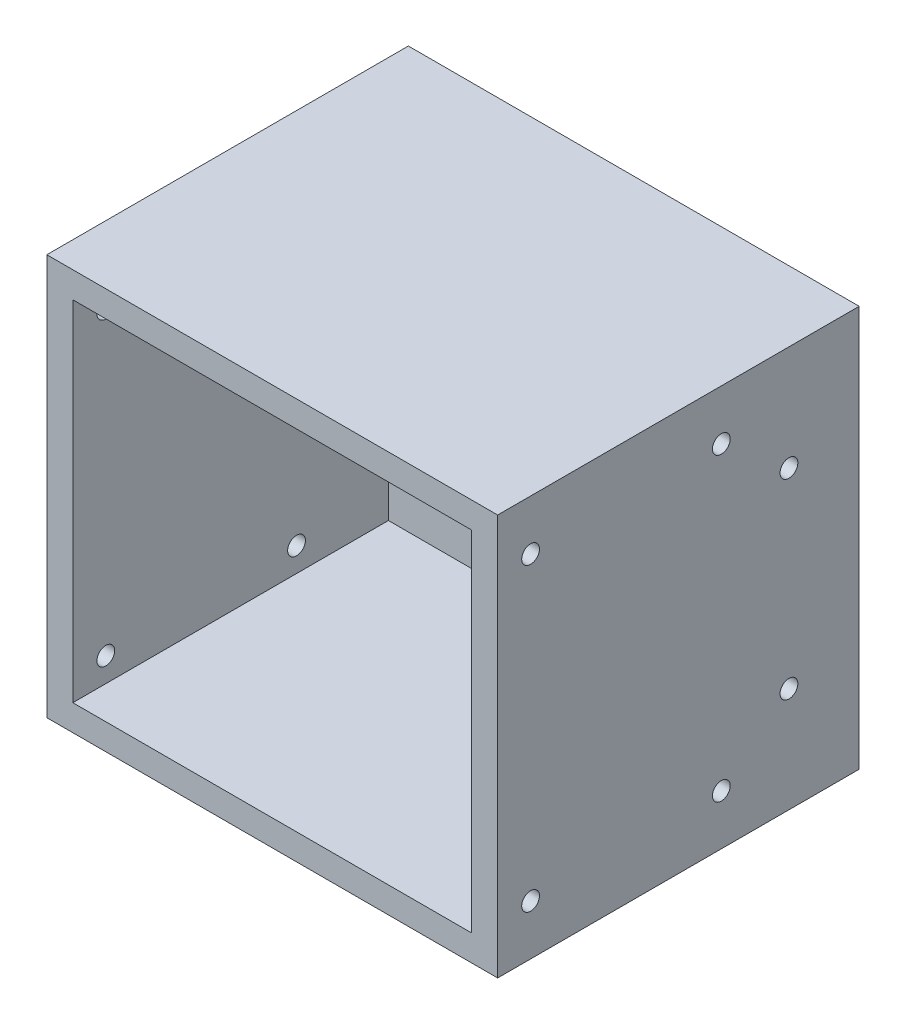
ISO-10303-21;
HEADER;
FILE_DESCRIPTION(('STEP AP214'),'2;1');
FILE_NAME('part.step','',(''),(''),'','','');
FILE_SCHEMA(('AUTOMOTIVE_DESIGN { 1 0 10303 214 1 1 1 1 }'));
ENDSEC;
DATA;
#1=APPLICATION_CONTEXT('core data for automotive mechanical design processes');
#2=APPLICATION_PROTOCOL_DEFINITION('international standard','automotive_design',2000,#1);
#3=PRODUCT_CONTEXT('',#1,'mechanical');
#4=PRODUCT('Part','Part','',(#3));
#5=PRODUCT_RELATED_PRODUCT_CATEGORY('part','',(#4));
#6=PRODUCT_DEFINITION_FORMATION('','',#4);
#7=PRODUCT_DEFINITION_CONTEXT('part definition',#1,'design');
#8=PRODUCT_DEFINITION('design','',#6,#7);
#9=PRODUCT_DEFINITION_SHAPE('','',#8);
#10=(LENGTH_UNIT() NAMED_UNIT(*) SI_UNIT(.MILLI.,.METRE.));
#11=(NAMED_UNIT(*) PLANE_ANGLE_UNIT() SI_UNIT($,.RADIAN.));
#12=(NAMED_UNIT(*) SI_UNIT($,.STERADIAN.) SOLID_ANGLE_UNIT());
#13=UNCERTAINTY_MEASURE_WITH_UNIT(LENGTH_MEASURE(1.E-05),#10,'distance_accuracy_value','');
#14=(GEOMETRIC_REPRESENTATION_CONTEXT(3) GLOBAL_UNCERTAINTY_ASSIGNED_CONTEXT((#13)) GLOBAL_UNIT_ASSIGNED_CONTEXT((#10,
#11,#12)) REPRESENTATION_CONTEXT('',''));
#15=CARTESIAN_POINT('',(0.,0.,0.));
#16=DIRECTION('',(0.,0.,1.));
#17=DIRECTION('',(1.,0.,0.));
#18=AXIS2_PLACEMENT_3D('',#15,#16,#17);
#19=CARTESIAN_POINT('',(0.,0.,-5.3));
#20=DIRECTION('',(0.,0.,-1.));
#21=DIRECTION('',(-1.,0.,0.));
#22=AXIS2_PLACEMENT_3D('',#19,#20,#21);
#23=PLANE('',#22);
#24=CARTESIAN_POINT('',(0.,0.,-5.3));
#25=DIRECTION('',(0.,0.,1.));
#26=DIRECTION('',(1.,0.,0.));
#27=AXIS2_PLACEMENT_3D('',#24,#25,#26);
#28=CIRCLE('',#27,14.);
#29=CARTESIAN_POINT('',(14.,0.,-5.3));
#30=VERTEX_POINT('',#29);
#31=EDGE_CURVE('E238',#30,#30,#28,.T.);
#32=ORIENTED_EDGE('',*,*,#31,.T.);
#33=EDGE_LOOP('',(#32));
#34=FACE_BOUND('',#33,.T.);
#35=DIRECTION('',(-1.,0.,0.));
#36=VECTOR('',#35,1.);
#37=CARTESIAN_POINT('',(-26.,23.125,-5.3));
#38=LINE('',#37,#36);
#39=CARTESIAN_POINT('',(26.,23.125,-5.30000000000001));
#40=VERTEX_POINT('',#39);
#41=CARTESIAN_POINT('',(-26.,23.125,-5.3));
#42=VERTEX_POINT('',#41);
#43=EDGE_CURVE('E166',#40,#42,#38,.T.);
#44=ORIENTED_EDGE('',*,*,#43,.F.);
#45=DIRECTION('',(0.,1.,0.));
#46=VECTOR('',#45,1.);
#47=CARTESIAN_POINT('',(26.,23.125,-5.30000000000001));
#48=LINE('',#47,#46);
#49=CARTESIAN_POINT('',(26.,-23.125,-5.29999999999999));
#50=VERTEX_POINT('',#49);
#51=EDGE_CURVE('E125',#50,#40,#48,.T.);
#52=ORIENTED_EDGE('',*,*,#51,.F.);
#53=DIRECTION('',(1.,0.,0.));
#54=VECTOR('',#53,1.);
#55=CARTESIAN_POINT('',(-26.,-23.125,-5.3));
#56=LINE('',#55,#54);
#57=CARTESIAN_POINT('',(-26.,-23.125,-5.3));
#58=VERTEX_POINT('',#57);
#59=EDGE_CURVE('E123',#58,#50,#56,.T.);
#60=ORIENTED_EDGE('',*,*,#59,.F.);
#61=DIRECTION('',(0.,-1.,0.));
#62=VECTOR('',#61,1.);
#63=CARTESIAN_POINT('',(-26.,-20.125,-5.3));
#64=LINE('',#63,#62);
#65=EDGE_CURVE('E108',#42,#58,#64,.T.);
#66=ORIENTED_EDGE('',*,*,#65,.F.);
#67=EDGE_LOOP('',(#44,#52,#60,#66));
#68=FACE_BOUND('',#67,.T.);
#69=ADVANCED_FACE('F39',(#34,#68),#23,.T.);
#70=CARTESIAN_POINT('',(0.,0.,0.));
#71=DIRECTION('',(0.,0.,-1.));
#72=DIRECTION('',(-1.,0.,0.));
#73=AXIS2_PLACEMENT_3D('',#70,#71,#72);
#74=PLANE('',#73);
#75=CARTESIAN_POINT('',(0.,0.,0.));
#76=DIRECTION('',(0.,0.,1.));
#77=DIRECTION('',(1.,0.,0.));
#78=AXIS2_PLACEMENT_3D('',#75,#76,#77);
#79=CIRCLE('',#78,14.);
#80=CARTESIAN_POINT('',(14.,0.,0.));
#81=VERTEX_POINT('',#80);
#82=EDGE_CURVE('E119',#81,#81,#79,.T.);
#83=ORIENTED_EDGE('',*,*,#82,.F.);
#84=EDGE_LOOP('',(#83));
#85=FACE_BOUND('',#84,.T.);
#86=DIRECTION('',(0.,1.,0.));
#87=VECTOR('',#86,1.);
#88=CARTESIAN_POINT('',(23.,-20.125,0.));
#89=LINE('',#88,#87);
#90=CARTESIAN_POINT('',(23.,-20.125,0.));
#91=VERTEX_POINT('',#90);
#92=CARTESIAN_POINT('',(23.,20.125,0.));
#93=VERTEX_POINT('',#92);
#94=EDGE_CURVE('E242',#91,#93,#89,.T.);
#95=ORIENTED_EDGE('',*,*,#94,.T.);
#96=DIRECTION('',(-1.,0.,0.));
#97=VECTOR('',#96,1.);
#98=CARTESIAN_POINT('',(-23.,20.125,0.));
#99=LINE('',#98,#97);
#100=CARTESIAN_POINT('',(-23.,20.125,0.));
#101=VERTEX_POINT('',#100);
#102=EDGE_CURVE('E249',#93,#101,#99,.T.);
#103=ORIENTED_EDGE('',*,*,#102,.T.);
#104=DIRECTION('',(0.,-1.,0.));
#105=VECTOR('',#104,1.);
#106=CARTESIAN_POINT('',(-23.,-20.125,0.));
#107=LINE('',#106,#105);
#108=CARTESIAN_POINT('',(-23.,-20.125,0.));
#109=VERTEX_POINT('',#108);
#110=EDGE_CURVE('E49',#101,#109,#107,.T.);
#111=ORIENTED_EDGE('',*,*,#110,.T.);
#112=DIRECTION('',(1.,0.,0.));
#113=VECTOR('',#112,1.);
#114=CARTESIAN_POINT('',(-23.,-20.125,0.));
#115=LINE('',#114,#113);
#116=EDGE_CURVE('E11',#109,#91,#115,.T.);
#117=ORIENTED_EDGE('',*,*,#116,.T.);
#118=EDGE_LOOP('',(#95,#103,#111,#117));
#119=FACE_BOUND('',#118,.T.);
#120=ADVANCED_FACE('F41',(#85,#119),#74,.F.);
#121=CARTESIAN_POINT('',(0.,0.,-5.3));
#122=DIRECTION('',(0.,0.,1.));
#123=DIRECTION('',(1.,0.,0.));
#124=AXIS2_PLACEMENT_3D('',#121,#122,#123);
#125=CYLINDRICAL_SURFACE('',#124,14.);
#126=ORIENTED_EDGE('',*,*,#31,.F.);
#127=EDGE_LOOP('',(#126));
#128=FACE_BOUND('',#127,.T.);
#129=ORIENTED_EDGE('',*,*,#82,.T.);
#130=EDGE_LOOP('',(#129));
#131=FACE_BOUND('',#130,.T.);
#132=ADVANCED_FACE('F298',(#128,#131),#125,.F.);
#133=CARTESIAN_POINT('',(-26.,0.,0.));
#134=DIRECTION('',(-1.,0.,0.));
#135=DIRECTION('',(0.,0.,1.));
#136=AXIS2_PLACEMENT_3D('',#133,#134,#135);
#137=PLANE('',#136);
#138=CARTESIAN_POINT('',(-26.,11.0249999999998,2.80000000000001));
#139=DIRECTION('',(-1.,0.,0.));
#140=DIRECTION('',(0.,0.,1.));
#141=AXIS2_PLACEMENT_3D('',#138,#139,#140);
#142=CIRCLE('',#141,1.025);
#143=CARTESIAN_POINT('',(-26.,11.0249999999998,3.82500000000001));
#144=VERTEX_POINT('',#143);
#145=EDGE_CURVE('E189',#144,#144,#142,.T.);
#146=ORIENTED_EDGE('',*,*,#145,.F.);
#147=EDGE_LOOP('',(#146));
#148=FACE_BOUND('',#147,.T.);
#149=CARTESIAN_POINT('',(-26.,-17.3249999999999,10.6));
#150=DIRECTION('',(-1.,0.,0.));
#151=DIRECTION('',(0.,0.,-1.));
#152=AXIS2_PLACEMENT_3D('',#149,#150,#151);
#153=CIRCLE('',#152,1.025);
#154=CARTESIAN_POINT('',(-26.,-17.3249999999999,9.575));
#155=VERTEX_POINT('',#154);
#156=EDGE_CURVE('E205',#155,#155,#153,.T.);
#157=ORIENTED_EDGE('',*,*,#156,.F.);
#158=EDGE_LOOP('',(#157));
#159=FACE_BOUND('',#158,.T.);
#160=CARTESIAN_POINT('',(-26.,17.325,32.6));
#161=DIRECTION('',(-1.,0.,0.));
#162=DIRECTION('',(0.,0.,1.));
#163=AXIS2_PLACEMENT_3D('',#160,#161,#162);
#164=CIRCLE('',#163,1.025);
#165=CARTESIAN_POINT('',(-26.,17.325,33.625));
#166=VERTEX_POINT('',#165);
#167=EDGE_CURVE('E221',#166,#166,#164,.T.);
#168=ORIENTED_EDGE('',*,*,#167,.F.);
#169=EDGE_LOOP('',(#168));
#170=FACE_BOUND('',#169,.T.);
#171=ORIENTED_EDGE('',*,*,#65,.T.);
#172=DIRECTION('',(0.,0.,-1.));
#173=VECTOR('',#172,1.);
#174=CARTESIAN_POINT('',(-26.,-23.125,36.4));
#175=LINE('',#174,#173);
#176=CARTESIAN_POINT('',(-26.,-23.125,36.4));
#177=VERTEX_POINT('',#176);
#178=EDGE_CURVE('E113',#177,#58,#175,.T.);
#179=ORIENTED_EDGE('',*,*,#178,.F.);
#180=DIRECTION('',(0.,1.,0.));
#181=VECTOR('',#180,1.);
#182=CARTESIAN_POINT('',(-26.,-20.125,36.4));
#183=LINE('',#182,#181);
#184=CARTESIAN_POINT('',(-26.,23.125,36.4));
#185=VERTEX_POINT('',#184);
#186=EDGE_CURVE('E120',#177,#185,#183,.T.);
#187=ORIENTED_EDGE('',*,*,#186,.T.);
#188=DIRECTION('',(0.,0.,1.));
#189=VECTOR('',#188,1.);
#190=CARTESIAN_POINT('',(-26.,23.125,-5.3));
#191=LINE('',#190,#189);
#192=EDGE_CURVE('E115',#42,#185,#191,.T.);
#193=ORIENTED_EDGE('',*,*,#192,.F.);
#194=EDGE_LOOP('',(#171,#179,#187,#193));
#195=FACE_BOUND('',#194,.T.);
#196=CARTESIAN_POINT('',(-26.,17.3249999999999,10.6));
#197=DIRECTION('',(-1.,0.,0.));
#198=DIRECTION('',(0.,0.,1.));
#199=AXIS2_PLACEMENT_3D('',#196,#197,#198);
#200=CIRCLE('',#199,1.025);
#201=CARTESIAN_POINT('',(-26.,17.3249999999999,11.625));
#202=VERTEX_POINT('',#201);
#203=EDGE_CURVE('E213',#202,#202,#200,.T.);
#204=ORIENTED_EDGE('',*,*,#203,.F.);
#205=EDGE_LOOP('',(#204));
#206=FACE_BOUND('',#205,.T.);
#207=CARTESIAN_POINT('',(-26.,-17.325,32.6));
#208=DIRECTION('',(-1.,0.,0.));
#209=DIRECTION('',(0.,0.,-1.));
#210=AXIS2_PLACEMENT_3D('',#207,#208,#209);
#211=CIRCLE('',#210,1.025);
#212=CARTESIAN_POINT('',(-26.,-17.325,31.575));
#213=VERTEX_POINT('',#212);
#214=EDGE_CURVE('E197',#213,#213,#211,.T.);
#215=ORIENTED_EDGE('',*,*,#214,.F.);
#216=EDGE_LOOP('',(#215));
#217=FACE_BOUND('',#216,.T.);
#218=CARTESIAN_POINT('',(-26.,-11.0249999999998,2.80000000000001));
#219=DIRECTION('',(-1.,0.,0.));
#220=DIRECTION('',(0.,0.,-1.));
#221=AXIS2_PLACEMENT_3D('',#218,#219,#220);
#222=CIRCLE('',#221,1.025);
#223=CARTESIAN_POINT('',(-26.,-11.0249999999998,1.77500000000001));
#224=VERTEX_POINT('',#223);
#225=EDGE_CURVE('E181',#224,#224,#222,.T.);
#226=ORIENTED_EDGE('',*,*,#225,.F.);
#227=EDGE_LOOP('',(#226));
#228=FACE_BOUND('',#227,.T.);
#229=ADVANCED_FACE('F110',(#148,#159,#170,#195,#206,#217,#228),#137,.T.);
#230=CARTESIAN_POINT('',(-23.,0.,0.));
#231=DIRECTION('',(-1.,0.,0.));
#232=DIRECTION('',(0.,0.,1.));
#233=AXIS2_PLACEMENT_3D('',#230,#231,#232);
#234=PLANE('',#233);
#235=ORIENTED_EDGE('',*,*,#110,.F.);
#236=DIRECTION('',(0.,0.,-1.));
#237=VECTOR('',#236,1.);
#238=CARTESIAN_POINT('',(-23.,20.125,-5.3));
#239=LINE('',#238,#237);
#240=CARTESIAN_POINT('',(-23.,20.125,36.4));
#241=VERTEX_POINT('',#240);
#242=EDGE_CURVE('E229',#241,#101,#239,.T.);
#243=ORIENTED_EDGE('',*,*,#242,.F.);
#244=DIRECTION('',(0.,1.,0.));
#245=VECTOR('',#244,1.);
#246=CARTESIAN_POINT('',(-23.,-20.125,36.4));
#247=LINE('',#246,#245);
#248=CARTESIAN_POINT('',(-23.,-20.125,36.4));
#249=VERTEX_POINT('',#248);
#250=EDGE_CURVE('E64',#249,#241,#247,.T.);
#251=ORIENTED_EDGE('',*,*,#250,.F.);
#252=DIRECTION('',(0.,0.,1.));
#253=VECTOR('',#252,1.);
#254=CARTESIAN_POINT('',(-23.,-20.125,-5.3));
#255=LINE('',#254,#253);
#256=EDGE_CURVE('E57',#109,#249,#255,.T.);
#257=ORIENTED_EDGE('',*,*,#256,.F.);
#258=EDGE_LOOP('',(#235,#243,#251,#257));
#259=FACE_BOUND('',#258,.T.);
#260=CARTESIAN_POINT('',(-23.,17.325,32.6));
#261=DIRECTION('',(-1.,0.,0.));
#262=DIRECTION('',(0.,0.,1.));
#263=AXIS2_PLACEMENT_3D('',#260,#261,#262);
#264=CIRCLE('',#263,1.025);
#265=CARTESIAN_POINT('',(-23.,17.325,33.625));
#266=VERTEX_POINT('',#265);
#267=EDGE_CURVE('E217',#266,#266,#264,.T.);
#268=ORIENTED_EDGE('',*,*,#267,.T.);
#269=EDGE_LOOP('',(#268));
#270=FACE_BOUND('',#269,.T.);
#271=CARTESIAN_POINT('',(-23.,17.3249999999999,10.6));
#272=DIRECTION('',(-1.,0.,0.));
#273=DIRECTION('',(0.,0.,1.));
#274=AXIS2_PLACEMENT_3D('',#271,#272,#273);
#275=CIRCLE('',#274,1.025);
#276=CARTESIAN_POINT('',(-23.,17.3249999999999,11.625));
#277=VERTEX_POINT('',#276);
#278=EDGE_CURVE('E209',#277,#277,#275,.T.);
#279=ORIENTED_EDGE('',*,*,#278,.T.);
#280=EDGE_LOOP('',(#279));
#281=FACE_BOUND('',#280,.T.);
#282=CARTESIAN_POINT('',(-23.,-17.3249999999999,10.6));
#283=DIRECTION('',(-1.,0.,0.));
#284=DIRECTION('',(0.,0.,-1.));
#285=AXIS2_PLACEMENT_3D('',#282,#283,#284);
#286=CIRCLE('',#285,1.025);
#287=CARTESIAN_POINT('',(-23.,-17.3249999999999,9.575));
#288=VERTEX_POINT('',#287);
#289=EDGE_CURVE('E201',#288,#288,#286,.T.);
#290=ORIENTED_EDGE('',*,*,#289,.T.);
#291=EDGE_LOOP('',(#290));
#292=FACE_BOUND('',#291,.T.);
#293=CARTESIAN_POINT('',(-23.,-17.325,32.6));
#294=DIRECTION('',(-1.,0.,0.));
#295=DIRECTION('',(0.,0.,-1.));
#296=AXIS2_PLACEMENT_3D('',#293,#294,#295);
#297=CIRCLE('',#296,1.025);
#298=CARTESIAN_POINT('',(-23.,-17.325,31.575));
#299=VERTEX_POINT('',#298);
#300=EDGE_CURVE('E193',#299,#299,#297,.T.);
#301=ORIENTED_EDGE('',*,*,#300,.T.);
#302=EDGE_LOOP('',(#301));
#303=FACE_BOUND('',#302,.T.);
#304=CARTESIAN_POINT('',(-23.,11.0249999999998,2.80000000000001));
#305=DIRECTION('',(-1.,0.,0.));
#306=DIRECTION('',(0.,0.,1.));
#307=AXIS2_PLACEMENT_3D('',#304,#305,#306);
#308=CIRCLE('',#307,1.025);
#309=CARTESIAN_POINT('',(-23.,11.0249999999998,3.82500000000001));
#310=VERTEX_POINT('',#309);
#311=EDGE_CURVE('E185',#310,#310,#308,.T.);
#312=ORIENTED_EDGE('',*,*,#311,.T.);
#313=EDGE_LOOP('',(#312));
#314=FACE_BOUND('',#313,.T.);
#315=CARTESIAN_POINT('',(-23.,-11.0249999999998,2.80000000000001));
#316=DIRECTION('',(-1.,0.,0.));
#317=DIRECTION('',(0.,0.,-1.));
#318=AXIS2_PLACEMENT_3D('',#315,#316,#317);
#319=CIRCLE('',#318,1.025);
#320=CARTESIAN_POINT('',(-23.,-11.0249999999998,1.77500000000001));
#321=VERTEX_POINT('',#320);
#322=EDGE_CURVE('E175',#321,#321,#319,.T.);
#323=ORIENTED_EDGE('',*,*,#322,.T.);
#324=EDGE_LOOP('',(#323));
#325=FACE_BOUND('',#324,.T.);
#326=ADVANCED_FACE('F308',(#259,#270,#281,#292,#303,#314,#325),#234,.F.);
#327=CARTESIAN_POINT('',(-26.,-20.125,36.4));
#328=DIRECTION('',(0.,0.,-1.));
#329=DIRECTION('',(-1.,0.,0.));
#330=AXIS2_PLACEMENT_3D('',#327,#328,#329);
#331=PLANE('',#330);
#332=DIRECTION('',(-1.,0.,0.));
#333=VECTOR('',#332,1.);
#334=CARTESIAN_POINT('',(-26.,-20.125,36.4));
#335=LINE('',#334,#333);
#336=CARTESIAN_POINT('',(23.,-20.125,36.4));
#337=VERTEX_POINT('',#336);
#338=EDGE_CURVE('E137',#337,#249,#335,.T.);
#339=ORIENTED_EDGE('',*,*,#338,.T.);
#340=ORIENTED_EDGE('',*,*,#250,.T.);
#341=DIRECTION('',(1.,0.,0.));
#342=VECTOR('',#341,1.);
#343=CARTESIAN_POINT('',(-26.,20.125,36.4));
#344=LINE('',#343,#342);
#345=CARTESIAN_POINT('',(23.,20.125,36.4));
#346=VERTEX_POINT('',#345);
#347=EDGE_CURVE('E160',#241,#346,#344,.T.);
#348=ORIENTED_EDGE('',*,*,#347,.T.);
#349=DIRECTION('',(0.,-1.,0.));
#350=VECTOR('',#349,1.);
#351=CARTESIAN_POINT('',(23.,23.125,36.4));
#352=LINE('',#351,#350);
#353=EDGE_CURVE('E148',#346,#337,#352,.T.);
#354=ORIENTED_EDGE('',*,*,#353,.T.);
#355=EDGE_LOOP('',(#339,#340,#348,#354));
#356=FACE_BOUND('',#355,.T.);
#357=ORIENTED_EDGE('',*,*,#186,.F.);
#358=DIRECTION('',(-1.,0.,0.));
#359=VECTOR('',#358,1.);
#360=CARTESIAN_POINT('',(-26.,-23.125,36.4));
#361=LINE('',#360,#359);
#362=CARTESIAN_POINT('',(26.,-23.125,36.4));
#363=VERTEX_POINT('',#362);
#364=EDGE_CURVE('E135',#363,#177,#361,.T.);
#365=ORIENTED_EDGE('',*,*,#364,.F.);
#366=DIRECTION('',(0.,-1.,0.));
#367=VECTOR('',#366,1.);
#368=CARTESIAN_POINT('',(26.,23.125,36.4));
#369=LINE('',#368,#367);
#370=CARTESIAN_POINT('',(26.,23.125,36.4));
#371=VERTEX_POINT('',#370);
#372=EDGE_CURVE('E150',#371,#363,#369,.T.);
#373=ORIENTED_EDGE('',*,*,#372,.F.);
#374=DIRECTION('',(1.,0.,0.));
#375=VECTOR('',#374,1.);
#376=CARTESIAN_POINT('',(-26.,23.125,36.4));
#377=LINE('',#376,#375);
#378=EDGE_CURVE('E172',#185,#371,#377,.T.);
#379=ORIENTED_EDGE('',*,*,#378,.F.);
#380=EDGE_LOOP('',(#357,#365,#373,#379));
#381=FACE_BOUND('',#380,.T.);
#382=ADVANCED_FACE('F304',(#356,#381),#331,.F.);
#383=CARTESIAN_POINT('',(-26.,17.325,32.6));
#384=DIRECTION('',(1.,0.,0.));
#385=DIRECTION('',(0.,0.,-1.));
#386=AXIS2_PLACEMENT_3D('',#383,#384,#385);
#387=CYLINDRICAL_SURFACE('',#386,1.025);
#388=ORIENTED_EDGE('',*,*,#167,.T.);
#389=EDGE_LOOP('',(#388));
#390=FACE_BOUND('',#389,.T.);
#391=ORIENTED_EDGE('',*,*,#267,.F.);
#392=EDGE_LOOP('',(#391));
#393=FACE_BOUND('',#392,.T.);
#394=ADVANCED_FACE('F307',(#390,#393),#387,.F.);
#395=CARTESIAN_POINT('',(-26.,17.3249999999999,10.6));
#396=DIRECTION('',(1.,0.,0.));
#397=DIRECTION('',(0.,0.,-1.));
#398=AXIS2_PLACEMENT_3D('',#395,#396,#397);
#399=CYLINDRICAL_SURFACE('',#398,1.025);
#400=ORIENTED_EDGE('',*,*,#203,.T.);
#401=EDGE_LOOP('',(#400));
#402=FACE_BOUND('',#401,.T.);
#403=ORIENTED_EDGE('',*,*,#278,.F.);
#404=EDGE_LOOP('',(#403));
#405=FACE_BOUND('',#404,.T.);
#406=ADVANCED_FACE('F316',(#402,#405),#399,.F.);
#407=CARTESIAN_POINT('',(-26.,-17.3249999999999,10.6));
#408=DIRECTION('',(1.,0.,0.));
#409=DIRECTION('',(0.,0.,-1.));
#410=AXIS2_PLACEMENT_3D('',#407,#408,#409);
#411=CYLINDRICAL_SURFACE('',#410,1.025);
#412=ORIENTED_EDGE('',*,*,#156,.T.);
#413=EDGE_LOOP('',(#412));
#414=FACE_BOUND('',#413,.T.);
#415=ORIENTED_EDGE('',*,*,#289,.F.);
#416=EDGE_LOOP('',(#415));
#417=FACE_BOUND('',#416,.T.);
#418=ADVANCED_FACE('F320',(#414,#417),#411,.F.);
#419=CARTESIAN_POINT('',(-26.,-17.325,32.6));
#420=DIRECTION('',(1.,0.,0.));
#421=DIRECTION('',(0.,0.,-1.));
#422=AXIS2_PLACEMENT_3D('',#419,#420,#421);
#423=CYLINDRICAL_SURFACE('',#422,1.025);
#424=ORIENTED_EDGE('',*,*,#214,.T.);
#425=EDGE_LOOP('',(#424));
#426=FACE_BOUND('',#425,.T.);
#427=ORIENTED_EDGE('',*,*,#300,.F.);
#428=EDGE_LOOP('',(#427));
#429=FACE_BOUND('',#428,.T.);
#430=ADVANCED_FACE('F324',(#426,#429),#423,.F.);
#431=CARTESIAN_POINT('',(-26.,11.0249999999998,2.80000000000001));
#432=DIRECTION('',(1.,0.,0.));
#433=DIRECTION('',(0.,0.,-1.));
#434=AXIS2_PLACEMENT_3D('',#431,#432,#433);
#435=CYLINDRICAL_SURFACE('',#434,1.025);
#436=ORIENTED_EDGE('',*,*,#145,.T.);
#437=EDGE_LOOP('',(#436));
#438=FACE_BOUND('',#437,.T.);
#439=ORIENTED_EDGE('',*,*,#311,.F.);
#440=EDGE_LOOP('',(#439));
#441=FACE_BOUND('',#440,.T.);
#442=ADVANCED_FACE('F328',(#438,#441),#435,.F.);
#443=CARTESIAN_POINT('',(-26.,-11.0249999999998,2.80000000000001));
#444=DIRECTION('',(1.,0.,0.));
#445=DIRECTION('',(0.,0.,-1.));
#446=AXIS2_PLACEMENT_3D('',#443,#444,#445);
#447=CYLINDRICAL_SURFACE('',#446,1.025);
#448=ORIENTED_EDGE('',*,*,#225,.T.);
#449=EDGE_LOOP('',(#448));
#450=FACE_BOUND('',#449,.T.);
#451=ORIENTED_EDGE('',*,*,#322,.F.);
#452=EDGE_LOOP('',(#451));
#453=FACE_BOUND('',#452,.T.);
#454=ADVANCED_FACE('F332',(#450,#453),#447,.F.);
#455=CARTESIAN_POINT('',(0.,20.125,0.));
#456=DIRECTION('',(0.,-1.,0.));
#457=DIRECTION('',(0.,0.,-1.));
#458=AXIS2_PLACEMENT_3D('',#455,#456,#457);
#459=PLANE('',#458);
#460=ORIENTED_EDGE('',*,*,#102,.F.);
#461=DIRECTION('',(0.,0.,-1.));
#462=VECTOR('',#461,1.);
#463=CARTESIAN_POINT('',(23.,20.125,-5.30000000000001));
#464=LINE('',#463,#462);
#465=EDGE_CURVE('E169',#346,#93,#464,.T.);
#466=ORIENTED_EDGE('',*,*,#465,.F.);
#467=ORIENTED_EDGE('',*,*,#347,.F.);
#468=ORIENTED_EDGE('',*,*,#242,.T.);
#469=EDGE_LOOP('',(#460,#466,#467,#468));
#470=FACE_BOUND('',#469,.T.);
#471=ADVANCED_FACE('F336',(#470),#459,.T.);
#472=CARTESIAN_POINT('',(0.,23.125,0.));
#473=DIRECTION('',(0.,-1.,0.));
#474=DIRECTION('',(0.,0.,-1.));
#475=AXIS2_PLACEMENT_3D('',#472,#473,#474);
#476=PLANE('',#475);
#477=ORIENTED_EDGE('',*,*,#43,.T.);
#478=ORIENTED_EDGE('',*,*,#192,.T.);
#479=ORIENTED_EDGE('',*,*,#378,.T.);
#480=DIRECTION('',(0.,0.,1.));
#481=VECTOR('',#480,1.);
#482=CARTESIAN_POINT('',(26.,23.125,36.4));
#483=LINE('',#482,#481);
#484=EDGE_CURVE('E156',#40,#371,#483,.T.);
#485=ORIENTED_EDGE('',*,*,#484,.F.);
#486=EDGE_LOOP('',(#477,#478,#479,#485));
#487=FACE_BOUND('',#486,.T.);
#488=ADVANCED_FACE('F340',(#487),#476,.F.);
#489=CARTESIAN_POINT('',(26.,0.,0.));
#490=DIRECTION('',(1.,0.,0.));
#491=DIRECTION('',(0.,0.,-1.));
#492=AXIS2_PLACEMENT_3D('',#489,#490,#491);
#493=PLANE('',#492);
#494=CARTESIAN_POINT('',(26.,17.3249999999999,10.6));
#495=DIRECTION('',(-1.,0.,0.));
#496=DIRECTION('',(0.,0.,1.));
#497=AXIS2_PLACEMENT_3D('',#494,#495,#496);
#498=CIRCLE('',#497,1.025);
#499=CARTESIAN_POINT('',(26.,17.3249999999999,11.625));
#500=VERTEX_POINT('',#499);
#501=EDGE_CURVE('E429',#500,#500,#498,.T.);
#502=ORIENTED_EDGE('',*,*,#501,.T.);
#503=EDGE_LOOP('',(#502));
#504=FACE_BOUND('',#503,.T.);
#505=CARTESIAN_POINT('',(26.,17.325,32.6));
#506=DIRECTION('',(-1.,0.,0.));
#507=DIRECTION('',(0.,0.,1.));
#508=AXIS2_PLACEMENT_3D('',#505,#506,#507);
#509=CIRCLE('',#508,1.025);
#510=CARTESIAN_POINT('',(26.,17.325,33.625));
#511=VERTEX_POINT('',#510);
#512=EDGE_CURVE('E433',#511,#511,#509,.T.);
#513=ORIENTED_EDGE('',*,*,#512,.T.);
#514=EDGE_LOOP('',(#513));
#515=FACE_BOUND('',#514,.T.);
#516=CARTESIAN_POINT('',(26.,-11.0249999999998,2.80000000000001));
#517=DIRECTION('',(-1.,0.,0.));
#518=DIRECTION('',(0.,0.,1.));
#519=AXIS2_PLACEMENT_3D('',#516,#517,#518);
#520=CIRCLE('',#519,1.025);
#521=CARTESIAN_POINT('',(26.,-11.0249999999998,3.82500000000001));
#522=VERTEX_POINT('',#521);
#523=EDGE_CURVE('E373',#522,#522,#520,.T.);
#524=ORIENTED_EDGE('',*,*,#523,.T.);
#525=EDGE_LOOP('',(#524));
#526=FACE_BOUND('',#525,.T.);
#527=CARTESIAN_POINT('',(26.,-17.3249999999999,10.6));
#528=DIRECTION('',(-1.,0.,0.));
#529=DIRECTION('',(0.,0.,1.));
#530=AXIS2_PLACEMENT_3D('',#527,#528,#529);
#531=CIRCLE('',#530,1.025);
#532=CARTESIAN_POINT('',(26.,-17.3249999999999,11.625));
#533=VERTEX_POINT('',#532);
#534=EDGE_CURVE('E424',#533,#533,#531,.T.);
#535=ORIENTED_EDGE('',*,*,#534,.T.);
#536=EDGE_LOOP('',(#535));
#537=FACE_BOUND('',#536,.T.);
#538=CARTESIAN_POINT('',(26.,-17.325,32.6));
#539=DIRECTION('',(-1.,0.,0.));
#540=DIRECTION('',(0.,0.,1.));
#541=AXIS2_PLACEMENT_3D('',#538,#539,#540);
#542=CIRCLE('',#541,1.025);
#543=CARTESIAN_POINT('',(26.,-17.325,33.625));
#544=VERTEX_POINT('',#543);
#545=EDGE_CURVE('E421',#544,#544,#542,.T.);
#546=ORIENTED_EDGE('',*,*,#545,.T.);
#547=EDGE_LOOP('',(#546));
#548=FACE_BOUND('',#547,.T.);
#549=CARTESIAN_POINT('',(26.,11.0249999999998,2.80000000000001));
#550=DIRECTION('',(-1.,0.,0.));
#551=DIRECTION('',(0.,0.,1.));
#552=AXIS2_PLACEMENT_3D('',#549,#550,#551);
#553=CIRCLE('',#552,1.025);
#554=CARTESIAN_POINT('',(26.,11.0249999999998,3.82500000000001));
#555=VERTEX_POINT('',#554);
#556=EDGE_CURVE('E142',#555,#555,#553,.T.);
#557=ORIENTED_EDGE('',*,*,#556,.T.);
#558=EDGE_LOOP('',(#557));
#559=FACE_BOUND('',#558,.T.);
#560=ORIENTED_EDGE('',*,*,#372,.T.);
#561=DIRECTION('',(0.,0.,1.));
#562=VECTOR('',#561,1.);
#563=CARTESIAN_POINT('',(26.,-23.125,36.4));
#564=LINE('',#563,#562);
#565=EDGE_CURVE('E130',#50,#363,#564,.T.);
#566=ORIENTED_EDGE('',*,*,#565,.F.);
#567=ORIENTED_EDGE('',*,*,#51,.T.);
#568=ORIENTED_EDGE('',*,*,#484,.T.);
#569=EDGE_LOOP('',(#560,#566,#567,#568));
#570=FACE_BOUND('',#569,.T.);
#571=ADVANCED_FACE('F344',(#504,#515,#526,#537,#548,#559,#570),#493,.T.);
#572=CARTESIAN_POINT('',(23.,0.,0.));
#573=DIRECTION('',(1.,0.,0.));
#574=DIRECTION('',(0.,0.,-1.));
#575=AXIS2_PLACEMENT_3D('',#572,#573,#574);
#576=PLANE('',#575);
#577=CARTESIAN_POINT('',(23.,17.3249999999999,10.6));
#578=DIRECTION('',(1.,0.,0.));
#579=DIRECTION('',(0.,0.,-1.));
#580=AXIS2_PLACEMENT_3D('',#577,#578,#579);
#581=CIRCLE('',#580,1.025);
#582=CARTESIAN_POINT('',(23.,17.3249999999999,9.575));
#583=VERTEX_POINT('',#582);
#584=EDGE_CURVE('E43',#583,#583,#581,.T.);
#585=ORIENTED_EDGE('',*,*,#584,.T.);
#586=EDGE_LOOP('',(#585));
#587=FACE_BOUND('',#586,.T.);
#588=CARTESIAN_POINT('',(23.,17.325,32.6));
#589=DIRECTION('',(1.,0.,0.));
#590=DIRECTION('',(0.,0.,-1.));
#591=AXIS2_PLACEMENT_3D('',#588,#589,#590);
#592=CIRCLE('',#591,1.025);
#593=CARTESIAN_POINT('',(23.,17.325,31.575));
#594=VERTEX_POINT('',#593);
#595=EDGE_CURVE('E269',#594,#594,#592,.T.);
#596=ORIENTED_EDGE('',*,*,#595,.T.);
#597=EDGE_LOOP('',(#596));
#598=FACE_BOUND('',#597,.T.);
#599=CARTESIAN_POINT('',(23.,-11.0249999999998,2.80000000000001));
#600=DIRECTION('',(1.,0.,0.));
#601=DIRECTION('',(0.,0.,-1.));
#602=AXIS2_PLACEMENT_3D('',#599,#600,#601);
#603=CIRCLE('',#602,1.025);
#604=CARTESIAN_POINT('',(23.,-11.0249999999998,1.77500000000001));
#605=VERTEX_POINT('',#604);
#606=EDGE_CURVE('E266',#605,#605,#603,.T.);
#607=ORIENTED_EDGE('',*,*,#606,.T.);
#608=EDGE_LOOP('',(#607));
#609=FACE_BOUND('',#608,.T.);
#610=CARTESIAN_POINT('',(23.,-17.3249999999999,10.6));
#611=DIRECTION('',(1.,0.,0.));
#612=DIRECTION('',(0.,0.,-1.));
#613=AXIS2_PLACEMENT_3D('',#610,#611,#612);
#614=CIRCLE('',#613,1.025);
#615=CARTESIAN_POINT('',(23.,-17.3249999999999,9.575));
#616=VERTEX_POINT('',#615);
#617=EDGE_CURVE('E262',#616,#616,#614,.T.);
#618=ORIENTED_EDGE('',*,*,#617,.T.);
#619=EDGE_LOOP('',(#618));
#620=FACE_BOUND('',#619,.T.);
#621=CARTESIAN_POINT('',(23.,-17.325,32.6));
#622=DIRECTION('',(1.,0.,0.));
#623=DIRECTION('',(0.,0.,-1.));
#624=AXIS2_PLACEMENT_3D('',#621,#622,#623);
#625=CIRCLE('',#624,1.025);
#626=CARTESIAN_POINT('',(23.,-17.325,31.575));
#627=VERTEX_POINT('',#626);
#628=EDGE_CURVE('E258',#627,#627,#625,.T.);
#629=ORIENTED_EDGE('',*,*,#628,.T.);
#630=EDGE_LOOP('',(#629));
#631=FACE_BOUND('',#630,.T.);
#632=CARTESIAN_POINT('',(23.,11.0249999999998,2.80000000000001));
#633=DIRECTION('',(1.,0.,0.));
#634=DIRECTION('',(0.,0.,-1.));
#635=AXIS2_PLACEMENT_3D('',#632,#633,#634);
#636=CIRCLE('',#635,1.025);
#637=CARTESIAN_POINT('',(23.,11.0249999999998,1.77500000000001));
#638=VERTEX_POINT('',#637);
#639=EDGE_CURVE('E254',#638,#638,#636,.T.);
#640=ORIENTED_EDGE('',*,*,#639,.T.);
#641=EDGE_LOOP('',(#640));
#642=FACE_BOUND('',#641,.T.);
#643=ORIENTED_EDGE('',*,*,#94,.F.);
#644=DIRECTION('',(0.,0.,-1.));
#645=VECTOR('',#644,1.);
#646=CARTESIAN_POINT('',(23.,-20.125,36.4));
#647=LINE('',#646,#645);
#648=EDGE_CURVE('E153',#337,#91,#647,.T.);
#649=ORIENTED_EDGE('',*,*,#648,.F.);
#650=ORIENTED_EDGE('',*,*,#353,.F.);
#651=ORIENTED_EDGE('',*,*,#465,.T.);
#652=EDGE_LOOP('',(#643,#649,#650,#651));
#653=FACE_BOUND('',#652,.T.);
#654=ADVANCED_FACE('F278',(#587,#598,#609,#620,#631,#642,#653),#576,.F.);
#655=CARTESIAN_POINT('',(0.,-20.125,0.));
#656=DIRECTION('',(0.,-1.,0.));
#657=DIRECTION('',(0.,0.,-1.));
#658=AXIS2_PLACEMENT_3D('',#655,#656,#657);
#659=PLANE('',#658);
#660=ORIENTED_EDGE('',*,*,#116,.F.);
#661=ORIENTED_EDGE('',*,*,#256,.T.);
#662=ORIENTED_EDGE('',*,*,#338,.F.);
#663=ORIENTED_EDGE('',*,*,#648,.T.);
#664=EDGE_LOOP('',(#660,#661,#662,#663));
#665=FACE_BOUND('',#664,.T.);
#666=ADVANCED_FACE('F348',(#665),#659,.F.);
#667=CARTESIAN_POINT('',(0.,-23.125,0.));
#668=DIRECTION('',(0.,-1.,0.));
#669=DIRECTION('',(0.,0.,-1.));
#670=AXIS2_PLACEMENT_3D('',#667,#668,#669);
#671=PLANE('',#670);
#672=ORIENTED_EDGE('',*,*,#178,.T.);
#673=ORIENTED_EDGE('',*,*,#59,.T.);
#674=ORIENTED_EDGE('',*,*,#565,.T.);
#675=ORIENTED_EDGE('',*,*,#364,.T.);
#676=EDGE_LOOP('',(#672,#673,#674,#675));
#677=FACE_BOUND('',#676,.T.);
#678=ADVANCED_FACE('F133',(#677),#671,.T.);
#679=CARTESIAN_POINT('',(26.,11.0249999999998,2.80000000000001));
#680=DIRECTION('',(-1.,0.,0.));
#681=DIRECTION('',(0.,0.,1.));
#682=AXIS2_PLACEMENT_3D('',#679,#680,#681);
#683=CYLINDRICAL_SURFACE('',#682,1.025);
#684=ORIENTED_EDGE('',*,*,#556,.F.);
#685=EDGE_LOOP('',(#684));
#686=FACE_BOUND('',#685,.T.);
#687=ORIENTED_EDGE('',*,*,#639,.F.);
#688=EDGE_LOOP('',(#687));
#689=FACE_BOUND('',#688,.T.);
#690=ADVANCED_FACE('F357',(#686,#689),#683,.F.);
#691=CARTESIAN_POINT('',(26.,-17.325,32.6));
#692=DIRECTION('',(-1.,0.,0.));
#693=DIRECTION('',(0.,0.,1.));
#694=AXIS2_PLACEMENT_3D('',#691,#692,#693);
#695=CYLINDRICAL_SURFACE('',#694,1.025);
#696=ORIENTED_EDGE('',*,*,#545,.F.);
#697=EDGE_LOOP('',(#696));
#698=FACE_BOUND('',#697,.T.);
#699=ORIENTED_EDGE('',*,*,#628,.F.);
#700=EDGE_LOOP('',(#699));
#701=FACE_BOUND('',#700,.T.);
#702=ADVANCED_FACE('F360',(#698,#701),#695,.F.);
#703=CARTESIAN_POINT('',(26.,-17.3249999999999,10.6));
#704=DIRECTION('',(-1.,0.,0.));
#705=DIRECTION('',(0.,0.,1.));
#706=AXIS2_PLACEMENT_3D('',#703,#704,#705);
#707=CYLINDRICAL_SURFACE('',#706,1.025);
#708=ORIENTED_EDGE('',*,*,#534,.F.);
#709=EDGE_LOOP('',(#708));
#710=FACE_BOUND('',#709,.T.);
#711=ORIENTED_EDGE('',*,*,#617,.F.);
#712=EDGE_LOOP('',(#711));
#713=FACE_BOUND('',#712,.T.);
#714=ADVANCED_FACE('F362',(#710,#713),#707,.F.);
#715=CARTESIAN_POINT('',(26.,-11.0249999999998,2.80000000000001));
#716=DIRECTION('',(-1.,0.,0.));
#717=DIRECTION('',(0.,0.,1.));
#718=AXIS2_PLACEMENT_3D('',#715,#716,#717);
#719=CYLINDRICAL_SURFACE('',#718,1.025);
#720=ORIENTED_EDGE('',*,*,#523,.F.);
#721=EDGE_LOOP('',(#720));
#722=FACE_BOUND('',#721,.T.);
#723=ORIENTED_EDGE('',*,*,#606,.F.);
#724=EDGE_LOOP('',(#723));
#725=FACE_BOUND('',#724,.T.);
#726=ADVANCED_FACE('F288',(#722,#725),#719,.F.);
#727=CARTESIAN_POINT('',(26.,17.325,32.6));
#728=DIRECTION('',(-1.,0.,0.));
#729=DIRECTION('',(0.,0.,1.));
#730=AXIS2_PLACEMENT_3D('',#727,#728,#729);
#731=CYLINDRICAL_SURFACE('',#730,1.025);
#732=ORIENTED_EDGE('',*,*,#512,.F.);
#733=EDGE_LOOP('',(#732));
#734=FACE_BOUND('',#733,.T.);
#735=ORIENTED_EDGE('',*,*,#595,.F.);
#736=EDGE_LOOP('',(#735));
#737=FACE_BOUND('',#736,.T.);
#738=ADVANCED_FACE('F282',(#734,#737),#731,.F.);
#739=CARTESIAN_POINT('',(26.,17.3249999999999,10.6));
#740=DIRECTION('',(-1.,0.,0.));
#741=DIRECTION('',(0.,0.,1.));
#742=AXIS2_PLACEMENT_3D('',#739,#740,#741);
#743=CYLINDRICAL_SURFACE('',#742,1.025);
#744=ORIENTED_EDGE('',*,*,#501,.F.);
#745=EDGE_LOOP('',(#744));
#746=FACE_BOUND('',#745,.T.);
#747=ORIENTED_EDGE('',*,*,#584,.F.);
#748=EDGE_LOOP('',(#747));
#749=FACE_BOUND('',#748,.T.);
#750=ADVANCED_FACE('F280',(#746,#749),#743,.F.);
#751=CLOSED_SHELL('',(#69,#120,#132,#229,#326,#382,#394,#406,#418,#430,#442,#454,#471,#488,#571,
#654,#666,#678,#690,#702,#714,#726,#738,#750));
#752=MANIFOLD_SOLID_BREP('B2',#751);
#753=ADVANCED_BREP_SHAPE_REPRESENTATION('',(#18,#752),#14);
#754=SHAPE_DEFINITION_REPRESENTATION(#9,#753);
ENDSEC;
END-ISO-10303-21;
